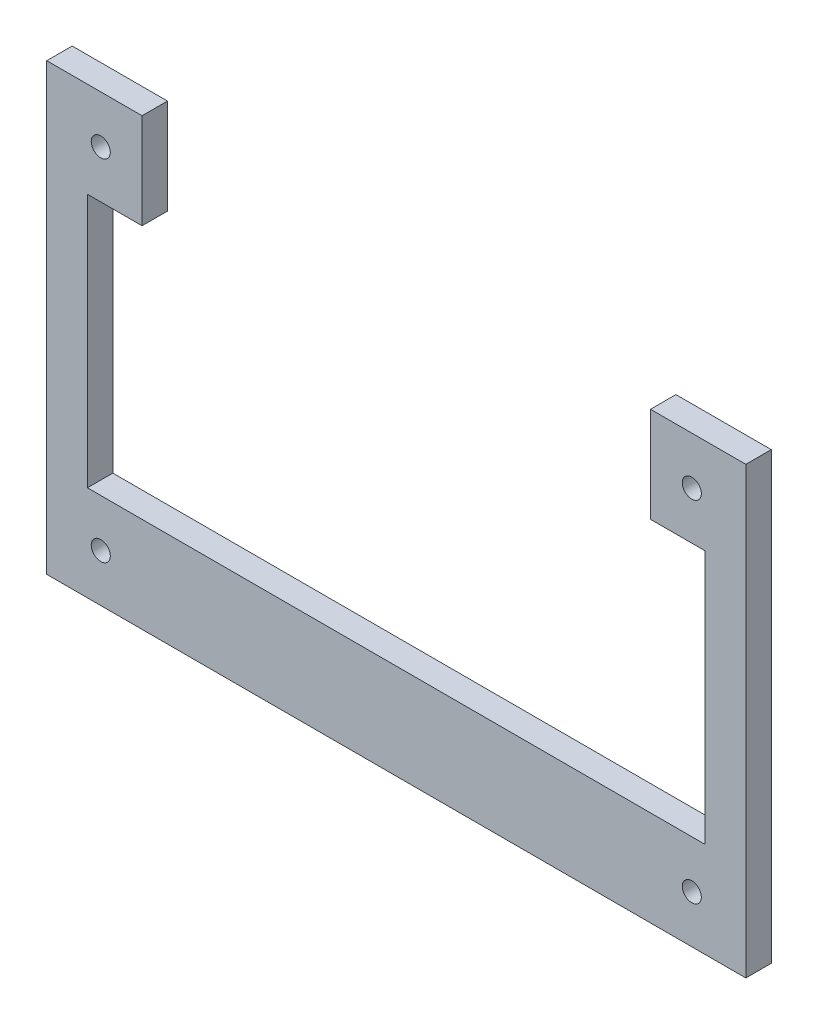
ISO-10303-21;
HEADER;
FILE_DESCRIPTION(('STEP AP214'),'2;1');
FILE_NAME('part.step','',(''),(''),'','','');
FILE_SCHEMA(('AUTOMOTIVE_DESIGN { 1 0 10303 214 1 1 1 1 }'));
ENDSEC;
DATA;
#1=APPLICATION_CONTEXT('core data for automotive mechanical design processes');
#2=APPLICATION_PROTOCOL_DEFINITION('international standard','automotive_design',2000,#1);
#3=PRODUCT_CONTEXT('',#1,'mechanical');
#4=PRODUCT('Part','Part','',(#3));
#5=PRODUCT_RELATED_PRODUCT_CATEGORY('part','',(#4));
#6=PRODUCT_DEFINITION_FORMATION('','',#4);
#7=PRODUCT_DEFINITION_CONTEXT('part definition',#1,'design');
#8=PRODUCT_DEFINITION('design','',#6,#7);
#9=PRODUCT_DEFINITION_SHAPE('','',#8);
#10=(LENGTH_UNIT() NAMED_UNIT(*) SI_UNIT(.MILLI.,.METRE.));
#11=(NAMED_UNIT(*) PLANE_ANGLE_UNIT() SI_UNIT($,.RADIAN.));
#12=(NAMED_UNIT(*) SI_UNIT($,.STERADIAN.) SOLID_ANGLE_UNIT());
#13=UNCERTAINTY_MEASURE_WITH_UNIT(LENGTH_MEASURE(1.E-05),#10,'distance_accuracy_value','');
#14=(GEOMETRIC_REPRESENTATION_CONTEXT(3) GLOBAL_UNCERTAINTY_ASSIGNED_CONTEXT((#13)) GLOBAL_UNIT_ASSIGNED_CONTEXT((#10,
#11,#12)) REPRESENTATION_CONTEXT('',''));
#15=CARTESIAN_POINT('',(0.,0.,0.));
#16=DIRECTION('',(0.,0.,1.));
#17=DIRECTION('',(1.,0.,0.));
#18=AXIS2_PLACEMENT_3D('',#15,#16,#17);
#19=CARTESIAN_POINT('',(-55.,35.,4.));
#20=DIRECTION('',(0.,-1.,0.));
#21=DIRECTION('',(0.,0.,-1.));
#22=AXIS2_PLACEMENT_3D('',#19,#20,#21);
#23=PLANE('',#22);
#24=DIRECTION('',(-1.,0.,0.));
#25=VECTOR('',#24,1.);
#26=CARTESIAN_POINT('',(-55.,35.,0.));
#27=LINE('',#26,#25);
#28=CARTESIAN_POINT('',(55.,35.,0.));
#29=VERTEX_POINT('',#28);
#30=CARTESIAN_POINT('',(40.,35.,0.));
#31=VERTEX_POINT('',#30);
#32=EDGE_CURVE('E195',#29,#31,#27,.T.);
#33=ORIENTED_EDGE('',*,*,#32,.T.);
#34=DIRECTION('',(0.,0.,-1.));
#35=VECTOR('',#34,1.);
#36=CARTESIAN_POINT('',(40.,35.,4.));
#37=LINE('',#36,#35);
#38=CARTESIAN_POINT('',(40.,35.,4.));
#39=VERTEX_POINT('',#38);
#40=EDGE_CURVE('E231',#39,#31,#37,.T.);
#41=ORIENTED_EDGE('',*,*,#40,.F.);
#42=DIRECTION('',(-1.,0.,0.));
#43=VECTOR('',#42,1.);
#44=CARTESIAN_POINT('',(-55.,35.,4.));
#45=LINE('',#44,#43);
#46=CARTESIAN_POINT('',(55.,35.,4.));
#47=VERTEX_POINT('',#46);
#48=EDGE_CURVE('E140',#47,#39,#45,.T.);
#49=ORIENTED_EDGE('',*,*,#48,.F.);
#50=DIRECTION('',(0.,0.,-1.));
#51=VECTOR('',#50,1.);
#52=CARTESIAN_POINT('',(55.,35.,4.));
#53=LINE('',#52,#51);
#54=EDGE_CURVE('E11',#47,#29,#53,.T.);
#55=ORIENTED_EDGE('',*,*,#54,.T.);
#56=EDGE_LOOP('',(#33,#41,#49,#55));
#57=FACE_BOUND('',#56,.T.);
#58=ADVANCED_FACE('F37',(#57),#23,.F.);
#59=CARTESIAN_POINT('',(48.6,20.,4.));
#60=DIRECTION('',(0.,1.,0.));
#61=DIRECTION('',(0.,0.,1.));
#62=AXIS2_PLACEMENT_3D('',#59,#60,#61);
#63=PLANE('',#62);
#64=DIRECTION('',(1.,0.,0.));
#65=VECTOR('',#64,1.);
#66=CARTESIAN_POINT('',(48.6,20.,4.));
#67=LINE('',#66,#65);
#68=CARTESIAN_POINT('',(40.,20.,4.));
#69=VERTEX_POINT('',#68);
#70=CARTESIAN_POINT('',(48.6,20.,4.));
#71=VERTEX_POINT('',#70);
#72=EDGE_CURVE('E137',#69,#71,#67,.T.);
#73=ORIENTED_EDGE('',*,*,#72,.F.);
#74=DIRECTION('',(0.,0.,-1.));
#75=VECTOR('',#74,1.);
#76=CARTESIAN_POINT('',(40.,20.,4.));
#77=LINE('',#76,#75);
#78=CARTESIAN_POINT('',(40.,20.,0.));
#79=VERTEX_POINT('',#78);
#80=EDGE_CURVE('E123',#69,#79,#77,.T.);
#81=ORIENTED_EDGE('',*,*,#80,.T.);
#82=DIRECTION('',(1.,0.,0.));
#83=VECTOR('',#82,1.);
#84=CARTESIAN_POINT('',(48.6,20.,0.));
#85=LINE('',#84,#83);
#86=CARTESIAN_POINT('',(48.6,20.,0.));
#87=VERTEX_POINT('',#86);
#88=EDGE_CURVE('E164',#79,#87,#85,.T.);
#89=ORIENTED_EDGE('',*,*,#88,.T.);
#90=DIRECTION('',(0.,0.,-1.));
#91=VECTOR('',#90,1.);
#92=CARTESIAN_POINT('',(48.6,20.,4.));
#93=LINE('',#92,#91);
#94=EDGE_CURVE('E146',#71,#87,#93,.T.);
#95=ORIENTED_EDGE('',*,*,#94,.F.);
#96=EDGE_LOOP('',(#73,#81,#89,#95));
#97=FACE_BOUND('',#96,.T.);
#98=ADVANCED_FACE('F144',(#97),#63,.F.);
#99=CARTESIAN_POINT('',(55.,-35.,4.));
#100=DIRECTION('',(-1.,0.,0.));
#101=DIRECTION('',(0.,0.,1.));
#102=AXIS2_PLACEMENT_3D('',#99,#100,#101);
#103=PLANE('',#102);
#104=DIRECTION('',(0.,1.,0.));
#105=VECTOR('',#104,1.);
#106=CARTESIAN_POINT('',(55.,-35.,0.));
#107=LINE('',#106,#105);
#108=CARTESIAN_POINT('',(55.,-35.,0.));
#109=VERTEX_POINT('',#108);
#110=EDGE_CURVE('E176',#109,#29,#107,.T.);
#111=ORIENTED_EDGE('',*,*,#110,.T.);
#112=ORIENTED_EDGE('',*,*,#54,.F.);
#113=DIRECTION('',(0.,1.,0.));
#114=VECTOR('',#113,1.);
#115=CARTESIAN_POINT('',(55.,-35.,4.));
#116=LINE('',#115,#114);
#117=CARTESIAN_POINT('',(55.,-35.,4.));
#118=VERTEX_POINT('',#117);
#119=EDGE_CURVE('E182',#118,#47,#116,.T.);
#120=ORIENTED_EDGE('',*,*,#119,.F.);
#121=DIRECTION('',(0.,0.,-1.));
#122=VECTOR('',#121,1.);
#123=CARTESIAN_POINT('',(55.,-35.,4.));
#124=LINE('',#123,#122);
#125=EDGE_CURVE('E191',#118,#109,#124,.T.);
#126=ORIENTED_EDGE('',*,*,#125,.T.);
#127=EDGE_LOOP('',(#111,#112,#120,#126));
#128=FACE_BOUND('',#127,.T.);
#129=ADVANCED_FACE('F39',(#128),#103,.F.);
#130=CARTESIAN_POINT('',(-40.,35.,4.));
#131=VERTEX_POINT('',#130);
#132=CARTESIAN_POINT('',(-55.,35.,4.));
#133=VERTEX_POINT('',#132);
#134=EDGE_CURVE('E184',#131,#133,#45,.T.);
#135=ORIENTED_EDGE('',*,*,#134,.F.);
#136=DIRECTION('',(0.,0.,-1.));
#137=VECTOR('',#136,1.);
#138=CARTESIAN_POINT('',(-40.,35.,4.));
#139=LINE('',#138,#137);
#140=CARTESIAN_POINT('',(-40.,35.,0.));
#141=VERTEX_POINT('',#140);
#142=EDGE_CURVE('E230',#131,#141,#139,.T.);
#143=ORIENTED_EDGE('',*,*,#142,.T.);
#144=CARTESIAN_POINT('',(-55.,35.,0.));
#145=VERTEX_POINT('',#144);
#146=EDGE_CURVE('E194',#141,#145,#27,.T.);
#147=ORIENTED_EDGE('',*,*,#146,.T.);
#148=DIRECTION('',(0.,0.,-1.));
#149=VECTOR('',#148,1.);
#150=CARTESIAN_POINT('',(-55.,35.,4.));
#151=LINE('',#150,#149);
#152=EDGE_CURVE('E45',#133,#145,#151,.T.);
#153=ORIENTED_EDGE('',*,*,#152,.F.);
#154=EDGE_LOOP('',(#135,#143,#147,#153));
#155=FACE_BOUND('',#154,.T.);
#156=ADVANCED_FACE('F229',(#155),#23,.F.);
#157=CARTESIAN_POINT('',(-55.,-35.,4.));
#158=DIRECTION('',(1.,0.,0.));
#159=DIRECTION('',(0.,0.,-1.));
#160=AXIS2_PLACEMENT_3D('',#157,#158,#159);
#161=PLANE('',#160);
#162=DIRECTION('',(0.,-1.,0.));
#163=VECTOR('',#162,1.);
#164=CARTESIAN_POINT('',(-55.,-35.,0.));
#165=LINE('',#164,#163);
#166=CARTESIAN_POINT('',(-55.,-35.,0.));
#167=VERTEX_POINT('',#166);
#168=EDGE_CURVE('E198',#145,#167,#165,.T.);
#169=ORIENTED_EDGE('',*,*,#168,.T.);
#170=DIRECTION('',(0.,0.,-1.));
#171=VECTOR('',#170,1.);
#172=CARTESIAN_POINT('',(-55.,-35.,4.));
#173=LINE('',#172,#171);
#174=CARTESIAN_POINT('',(-55.,-35.,4.));
#175=VERTEX_POINT('',#174);
#176=EDGE_CURVE('E203',#175,#167,#173,.T.);
#177=ORIENTED_EDGE('',*,*,#176,.F.);
#178=DIRECTION('',(0.,-1.,0.));
#179=VECTOR('',#178,1.);
#180=CARTESIAN_POINT('',(-55.,-35.,4.));
#181=LINE('',#180,#179);
#182=EDGE_CURVE('E187',#133,#175,#181,.T.);
#183=ORIENTED_EDGE('',*,*,#182,.F.);
#184=ORIENTED_EDGE('',*,*,#152,.T.);
#185=EDGE_LOOP('',(#169,#177,#183,#184));
#186=FACE_BOUND('',#185,.T.);
#187=ADVANCED_FACE('F210',(#186),#161,.F.);
#188=CARTESIAN_POINT('',(-55.,-35.,4.));
#189=DIRECTION('',(0.,1.,0.));
#190=DIRECTION('',(0.,0.,1.));
#191=AXIS2_PLACEMENT_3D('',#188,#189,#190);
#192=PLANE('',#191);
#193=DIRECTION('',(1.,0.,0.));
#194=VECTOR('',#193,1.);
#195=CARTESIAN_POINT('',(-55.,-35.,0.));
#196=LINE('',#195,#194);
#197=EDGE_CURVE('E185',#167,#109,#196,.T.);
#198=ORIENTED_EDGE('',*,*,#197,.T.);
#199=ORIENTED_EDGE('',*,*,#125,.F.);
#200=DIRECTION('',(1.,0.,0.));
#201=VECTOR('',#200,1.);
#202=CARTESIAN_POINT('',(-55.,-35.,4.));
#203=LINE('',#202,#201);
#204=EDGE_CURVE('E189',#175,#118,#203,.T.);
#205=ORIENTED_EDGE('',*,*,#204,.F.);
#206=ORIENTED_EDGE('',*,*,#176,.T.);
#207=EDGE_LOOP('',(#198,#199,#205,#206));
#208=FACE_BOUND('',#207,.T.);
#209=ADVANCED_FACE('F223',(#208),#192,.F.);
#210=CARTESIAN_POINT('',(0.,0.,4.));
#211=DIRECTION('',(0.,0.,-1.));
#212=DIRECTION('',(-1.,0.,0.));
#213=AXIS2_PLACEMENT_3D('',#210,#211,#212);
#214=PLANE('',#213);
#215=CARTESIAN_POINT('',(46.5,27.5,4.));
#216=DIRECTION('',(0.,0.,-1.));
#217=DIRECTION('',(-1.,0.,0.));
#218=AXIS2_PLACEMENT_3D('',#215,#216,#217);
#219=CIRCLE('',#218,1.5);
#220=CARTESIAN_POINT('',(45.,27.5,4.));
#221=VERTEX_POINT('',#220);
#222=EDGE_CURVE('E240',#221,#221,#219,.T.);
#223=ORIENTED_EDGE('',*,*,#222,.T.);
#224=EDGE_LOOP('',(#223));
#225=FACE_BOUND('',#224,.T.);
#226=CARTESIAN_POINT('',(-46.5,27.5,4.));
#227=DIRECTION('',(0.,0.,-1.));
#228=DIRECTION('',(-1.,0.,0.));
#229=AXIS2_PLACEMENT_3D('',#226,#227,#228);
#230=CIRCLE('',#229,1.5);
#231=CARTESIAN_POINT('',(-48.,27.5,4.));
#232=VERTEX_POINT('',#231);
#233=EDGE_CURVE('E246',#232,#232,#230,.T.);
#234=ORIENTED_EDGE('',*,*,#233,.T.);
#235=EDGE_LOOP('',(#234));
#236=FACE_BOUND('',#235,.T.);
#237=CARTESIAN_POINT('',(-46.5,-27.5,4.));
#238=DIRECTION('',(0.,0.,-1.));
#239=DIRECTION('',(-1.,0.,0.));
#240=AXIS2_PLACEMENT_3D('',#237,#238,#239);
#241=CIRCLE('',#240,1.5);
#242=CARTESIAN_POINT('',(-48.,-27.5,4.));
#243=VERTEX_POINT('',#242);
#244=EDGE_CURVE('E252',#243,#243,#241,.T.);
#245=ORIENTED_EDGE('',*,*,#244,.T.);
#246=EDGE_LOOP('',(#245));
#247=FACE_BOUND('',#246,.T.);
#248=CARTESIAN_POINT('',(46.5,-27.5,4.));
#249=DIRECTION('',(0.,0.,-1.));
#250=DIRECTION('',(-1.,0.,0.));
#251=AXIS2_PLACEMENT_3D('',#248,#249,#250);
#252=CIRCLE('',#251,1.5);
#253=CARTESIAN_POINT('',(45.,-27.5,4.));
#254=VERTEX_POINT('',#253);
#255=EDGE_CURVE('E165',#254,#254,#252,.T.);
#256=ORIENTED_EDGE('',*,*,#255,.T.);
#257=EDGE_LOOP('',(#256));
#258=FACE_BOUND('',#257,.T.);
#259=ORIENTED_EDGE('',*,*,#48,.T.);
#260=DIRECTION('',(0.,-1.,0.));
#261=VECTOR('',#260,1.);
#262=CARTESIAN_POINT('',(40.,20.,4.));
#263=LINE('',#262,#261);
#264=EDGE_CURVE('E126',#39,#69,#263,.T.);
#265=ORIENTED_EDGE('',*,*,#264,.T.);
#266=ORIENTED_EDGE('',*,*,#72,.T.);
#267=DIRECTION('',(0.,-1.,0.));
#268=VECTOR('',#267,1.);
#269=CARTESIAN_POINT('',(48.6,-20.,4.));
#270=LINE('',#269,#268);
#271=CARTESIAN_POINT('',(48.6,-20.,4.));
#272=VERTEX_POINT('',#271);
#273=EDGE_CURVE('E151',#71,#272,#270,.T.);
#274=ORIENTED_EDGE('',*,*,#273,.T.);
#275=DIRECTION('',(-1.,0.,0.));
#276=VECTOR('',#275,1.);
#277=CARTESIAN_POINT('',(48.6,-20.,4.));
#278=LINE('',#277,#276);
#279=CARTESIAN_POINT('',(-48.6,-20.,4.));
#280=VERTEX_POINT('',#279);
#281=EDGE_CURVE('E158',#272,#280,#278,.T.);
#282=ORIENTED_EDGE('',*,*,#281,.T.);
#283=DIRECTION('',(0.,1.,0.));
#284=VECTOR('',#283,1.);
#285=CARTESIAN_POINT('',(-48.6,-20.,4.));
#286=LINE('',#285,#284);
#287=CARTESIAN_POINT('',(-48.6,20.,4.));
#288=VERTEX_POINT('',#287);
#289=EDGE_CURVE('E148',#280,#288,#286,.T.);
#290=ORIENTED_EDGE('',*,*,#289,.T.);
#291=CARTESIAN_POINT('',(-40.,20.,4.));
#292=VERTEX_POINT('',#291);
#293=EDGE_CURVE('E147',#288,#292,#67,.T.);
#294=ORIENTED_EDGE('',*,*,#293,.T.);
#295=DIRECTION('',(0.,1.,0.));
#296=VECTOR('',#295,1.);
#297=CARTESIAN_POINT('',(-40.,20.,4.));
#298=LINE('',#297,#296);
#299=EDGE_CURVE('E52',#292,#131,#298,.T.);
#300=ORIENTED_EDGE('',*,*,#299,.T.);
#301=ORIENTED_EDGE('',*,*,#134,.T.);
#302=ORIENTED_EDGE('',*,*,#182,.T.);
#303=ORIENTED_EDGE('',*,*,#204,.T.);
#304=ORIENTED_EDGE('',*,*,#119,.T.);
#305=EDGE_LOOP('',(#259,#265,#266,#274,#282,#290,#294,#300,#301,#302,#303,#304));
#306=FACE_BOUND('',#305,.T.);
#307=ADVANCED_FACE('F135',(#225,#236,#247,#258,#306),#214,.F.);
#308=CARTESIAN_POINT('',(0.,0.,0.));
#309=DIRECTION('',(0.,0.,-1.));
#310=DIRECTION('',(-1.,0.,0.));
#311=AXIS2_PLACEMENT_3D('',#308,#309,#310);
#312=PLANE('',#311);
#313=DIRECTION('',(0.,-1.,0.));
#314=VECTOR('',#313,1.);
#315=CARTESIAN_POINT('',(40.,20.,0.));
#316=LINE('',#315,#314);
#317=EDGE_CURVE('E60',#31,#79,#316,.T.);
#318=ORIENTED_EDGE('',*,*,#317,.F.);
#319=ORIENTED_EDGE('',*,*,#32,.F.);
#320=ORIENTED_EDGE('',*,*,#110,.F.);
#321=ORIENTED_EDGE('',*,*,#197,.F.);
#322=ORIENTED_EDGE('',*,*,#168,.F.);
#323=ORIENTED_EDGE('',*,*,#146,.F.);
#324=DIRECTION('',(0.,1.,0.));
#325=VECTOR('',#324,1.);
#326=CARTESIAN_POINT('',(-40.,20.,0.));
#327=LINE('',#326,#325);
#328=CARTESIAN_POINT('',(-40.,20.,0.));
#329=VERTEX_POINT('',#328);
#330=EDGE_CURVE('E141',#329,#141,#327,.T.);
#331=ORIENTED_EDGE('',*,*,#330,.F.);
#332=CARTESIAN_POINT('',(-48.6,20.,0.));
#333=VERTEX_POINT('',#332);
#334=EDGE_CURVE('E166',#333,#329,#85,.T.);
#335=ORIENTED_EDGE('',*,*,#334,.F.);
#336=DIRECTION('',(0.,1.,0.));
#337=VECTOR('',#336,1.);
#338=CARTESIAN_POINT('',(-48.6,-20.,0.));
#339=LINE('',#338,#337);
#340=CARTESIAN_POINT('',(-48.6,-20.,0.));
#341=VERTEX_POINT('',#340);
#342=EDGE_CURVE('E162',#341,#333,#339,.T.);
#343=ORIENTED_EDGE('',*,*,#342,.F.);
#344=DIRECTION('',(-1.,0.,0.));
#345=VECTOR('',#344,1.);
#346=CARTESIAN_POINT('',(48.6,-20.,0.));
#347=LINE('',#346,#345);
#348=CARTESIAN_POINT('',(48.6,-20.,0.));
#349=VERTEX_POINT('',#348);
#350=EDGE_CURVE('E153',#349,#341,#347,.T.);
#351=ORIENTED_EDGE('',*,*,#350,.F.);
#352=DIRECTION('',(0.,-1.,0.));
#353=VECTOR('',#352,1.);
#354=CARTESIAN_POINT('',(48.6,-20.,0.));
#355=LINE('',#354,#353);
#356=EDGE_CURVE('E169',#87,#349,#355,.T.);
#357=ORIENTED_EDGE('',*,*,#356,.F.);
#358=ORIENTED_EDGE('',*,*,#88,.F.);
#359=EDGE_LOOP('',(#318,#319,#320,#321,#322,#323,#331,#335,#343,#351,#357,#358));
#360=FACE_BOUND('',#359,.T.);
#361=CARTESIAN_POINT('',(46.5,27.5,0.));
#362=DIRECTION('',(0.,0.,-1.));
#363=DIRECTION('',(-1.,0.,0.));
#364=AXIS2_PLACEMENT_3D('',#361,#362,#363);
#365=CIRCLE('',#364,1.5);
#366=CARTESIAN_POINT('',(45.,27.5,0.));
#367=VERTEX_POINT('',#366);
#368=EDGE_CURVE('E233',#367,#367,#365,.T.);
#369=ORIENTED_EDGE('',*,*,#368,.F.);
#370=EDGE_LOOP('',(#369));
#371=FACE_BOUND('',#370,.T.);
#372=CARTESIAN_POINT('',(-46.5,27.5,0.));
#373=DIRECTION('',(0.,0.,-1.));
#374=DIRECTION('',(-1.,0.,0.));
#375=AXIS2_PLACEMENT_3D('',#372,#373,#374);
#376=CIRCLE('',#375,1.5);
#377=CARTESIAN_POINT('',(-48.,27.5,0.));
#378=VERTEX_POINT('',#377);
#379=EDGE_CURVE('E243',#378,#378,#376,.T.);
#380=ORIENTED_EDGE('',*,*,#379,.F.);
#381=EDGE_LOOP('',(#380));
#382=FACE_BOUND('',#381,.T.);
#383=CARTESIAN_POINT('',(-46.5,-27.5,0.));
#384=DIRECTION('',(0.,0.,-1.));
#385=DIRECTION('',(-1.,0.,0.));
#386=AXIS2_PLACEMENT_3D('',#383,#384,#385);
#387=CIRCLE('',#386,1.5);
#388=CARTESIAN_POINT('',(-48.,-27.5,0.));
#389=VERTEX_POINT('',#388);
#390=EDGE_CURVE('E249',#389,#389,#387,.T.);
#391=ORIENTED_EDGE('',*,*,#390,.F.);
#392=EDGE_LOOP('',(#391));
#393=FACE_BOUND('',#392,.T.);
#394=CARTESIAN_POINT('',(46.5,-27.5,0.));
#395=DIRECTION('',(0.,0.,-1.));
#396=DIRECTION('',(-1.,0.,0.));
#397=AXIS2_PLACEMENT_3D('',#394,#395,#396);
#398=CIRCLE('',#397,1.5);
#399=CARTESIAN_POINT('',(45.,-27.5,0.));
#400=VERTEX_POINT('',#399);
#401=EDGE_CURVE('E255',#400,#400,#398,.T.);
#402=ORIENTED_EDGE('',*,*,#401,.F.);
#403=EDGE_LOOP('',(#402));
#404=FACE_BOUND('',#403,.T.);
#405=ADVANCED_FACE('F217',(#360,#371,#382,#393,#404),#312,.T.);
#406=CARTESIAN_POINT('',(-48.6,-20.,4.));
#407=DIRECTION('',(-1.,0.,0.));
#408=DIRECTION('',(0.,0.,1.));
#409=AXIS2_PLACEMENT_3D('',#406,#407,#408);
#410=PLANE('',#409);
#411=ORIENTED_EDGE('',*,*,#342,.T.);
#412=DIRECTION('',(0.,0.,-1.));
#413=VECTOR('',#412,1.);
#414=CARTESIAN_POINT('',(-48.6,20.,4.));
#415=LINE('',#414,#413);
#416=EDGE_CURVE('E161',#288,#333,#415,.T.);
#417=ORIENTED_EDGE('',*,*,#416,.F.);
#418=ORIENTED_EDGE('',*,*,#289,.F.);
#419=DIRECTION('',(0.,0.,-1.));
#420=VECTOR('',#419,1.);
#421=CARTESIAN_POINT('',(-48.6,-20.,4.));
#422=LINE('',#421,#420);
#423=EDGE_CURVE('E174',#280,#341,#422,.T.);
#424=ORIENTED_EDGE('',*,*,#423,.T.);
#425=EDGE_LOOP('',(#411,#417,#418,#424));
#426=FACE_BOUND('',#425,.T.);
#427=ADVANCED_FACE('F270',(#426),#410,.F.);
#428=CARTESIAN_POINT('',(48.6,-20.,4.));
#429=DIRECTION('',(0.,-1.,0.));
#430=DIRECTION('',(0.,0.,-1.));
#431=AXIS2_PLACEMENT_3D('',#428,#429,#430);
#432=PLANE('',#431);
#433=ORIENTED_EDGE('',*,*,#350,.T.);
#434=ORIENTED_EDGE('',*,*,#423,.F.);
#435=ORIENTED_EDGE('',*,*,#281,.F.);
#436=DIRECTION('',(0.,0.,-1.));
#437=VECTOR('',#436,1.);
#438=CARTESIAN_POINT('',(48.6,-20.,4.));
#439=LINE('',#438,#437);
#440=EDGE_CURVE('E177',#272,#349,#439,.T.);
#441=ORIENTED_EDGE('',*,*,#440,.T.);
#442=EDGE_LOOP('',(#433,#434,#435,#441));
#443=FACE_BOUND('',#442,.T.);
#444=ADVANCED_FACE('F277',(#443),#432,.F.);
#445=CARTESIAN_POINT('',(48.6,-20.,4.));
#446=DIRECTION('',(1.,0.,0.));
#447=DIRECTION('',(0.,0.,-1.));
#448=AXIS2_PLACEMENT_3D('',#445,#446,#447);
#449=PLANE('',#448);
#450=ORIENTED_EDGE('',*,*,#356,.T.);
#451=ORIENTED_EDGE('',*,*,#440,.F.);
#452=ORIENTED_EDGE('',*,*,#273,.F.);
#453=ORIENTED_EDGE('',*,*,#94,.T.);
#454=EDGE_LOOP('',(#450,#451,#452,#453));
#455=FACE_BOUND('',#454,.T.);
#456=ADVANCED_FACE('F335',(#455),#449,.F.);
#457=ORIENTED_EDGE('',*,*,#334,.T.);
#458=DIRECTION('',(0.,0.,-1.));
#459=VECTOR('',#458,1.);
#460=CARTESIAN_POINT('',(-40.,20.,4.));
#461=LINE('',#460,#459);
#462=EDGE_CURVE('E131',#292,#329,#461,.T.);
#463=ORIENTED_EDGE('',*,*,#462,.F.);
#464=ORIENTED_EDGE('',*,*,#293,.F.);
#465=ORIENTED_EDGE('',*,*,#416,.T.);
#466=EDGE_LOOP('',(#457,#463,#464,#465));
#467=FACE_BOUND('',#466,.T.);
#468=ADVANCED_FACE('F265',(#467),#63,.F.);
#469=CARTESIAN_POINT('',(46.5,-27.5,0.));
#470=DIRECTION('',(0.,0.,-1.));
#471=DIRECTION('',(-1.,0.,0.));
#472=AXIS2_PLACEMENT_3D('',#469,#470,#471);
#473=CYLINDRICAL_SURFACE('',#472,1.5);
#474=ORIENTED_EDGE('',*,*,#255,.F.);
#475=EDGE_LOOP('',(#474));
#476=FACE_BOUND('',#475,.T.);
#477=ORIENTED_EDGE('',*,*,#401,.T.);
#478=EDGE_LOOP('',(#477));
#479=FACE_BOUND('',#478,.T.);
#480=ADVANCED_FACE('F261',(#476,#479),#473,.F.);
#481=CARTESIAN_POINT('',(-46.5,-27.5,0.));
#482=DIRECTION('',(0.,0.,-1.));
#483=DIRECTION('',(-1.,0.,0.));
#484=AXIS2_PLACEMENT_3D('',#481,#482,#483);
#485=CYLINDRICAL_SURFACE('',#484,1.5);
#486=ORIENTED_EDGE('',*,*,#244,.F.);
#487=EDGE_LOOP('',(#486));
#488=FACE_BOUND('',#487,.T.);
#489=ORIENTED_EDGE('',*,*,#390,.T.);
#490=EDGE_LOOP('',(#489));
#491=FACE_BOUND('',#490,.T.);
#492=ADVANCED_FACE('F264',(#488,#491),#485,.F.);
#493=CARTESIAN_POINT('',(-46.5,27.5,0.));
#494=DIRECTION('',(0.,0.,-1.));
#495=DIRECTION('',(-1.,0.,0.));
#496=AXIS2_PLACEMENT_3D('',#493,#494,#495);
#497=CYLINDRICAL_SURFACE('',#496,1.5);
#498=ORIENTED_EDGE('',*,*,#233,.F.);
#499=EDGE_LOOP('',(#498));
#500=FACE_BOUND('',#499,.T.);
#501=ORIENTED_EDGE('',*,*,#379,.T.);
#502=EDGE_LOOP('',(#501));
#503=FACE_BOUND('',#502,.T.);
#504=ADVANCED_FACE('F362',(#500,#503),#497,.F.);
#505=CARTESIAN_POINT('',(46.5,27.5,0.));
#506=DIRECTION('',(0.,0.,-1.));
#507=DIRECTION('',(-1.,0.,0.));
#508=AXIS2_PLACEMENT_3D('',#505,#506,#507);
#509=CYLINDRICAL_SURFACE('',#508,1.5);
#510=ORIENTED_EDGE('',*,*,#222,.F.);
#511=EDGE_LOOP('',(#510));
#512=FACE_BOUND('',#511,.T.);
#513=ORIENTED_EDGE('',*,*,#368,.T.);
#514=EDGE_LOOP('',(#513));
#515=FACE_BOUND('',#514,.T.);
#516=ADVANCED_FACE('F370',(#512,#515),#509,.F.);
#517=CARTESIAN_POINT('',(-40.,20.,4.));
#518=DIRECTION('',(-1.,0.,0.));
#519=DIRECTION('',(0.,0.,1.));
#520=AXIS2_PLACEMENT_3D('',#517,#518,#519);
#521=PLANE('',#520);
#522=ORIENTED_EDGE('',*,*,#330,.T.);
#523=ORIENTED_EDGE('',*,*,#142,.F.);
#524=ORIENTED_EDGE('',*,*,#299,.F.);
#525=ORIENTED_EDGE('',*,*,#462,.T.);
#526=EDGE_LOOP('',(#522,#523,#524,#525));
#527=FACE_BOUND('',#526,.T.);
#528=ADVANCED_FACE('F378',(#527),#521,.F.);
#529=CARTESIAN_POINT('',(40.,20.,4.));
#530=DIRECTION('',(1.,0.,0.));
#531=DIRECTION('',(0.,0.,-1.));
#532=AXIS2_PLACEMENT_3D('',#529,#530,#531);
#533=PLANE('',#532);
#534=ORIENTED_EDGE('',*,*,#317,.T.);
#535=ORIENTED_EDGE('',*,*,#80,.F.);
#536=ORIENTED_EDGE('',*,*,#264,.F.);
#537=ORIENTED_EDGE('',*,*,#40,.T.);
#538=EDGE_LOOP('',(#534,#535,#536,#537));
#539=FACE_BOUND('',#538,.T.);
#540=ADVANCED_FACE('F125',(#539),#533,.F.);
#541=CLOSED_SHELL('',(#58,#98,#129,#156,#187,#209,#307,#405,#427,#444,#456,#468,#480,#492,#504,
#516,#528,#540));
#542=MANIFOLD_SOLID_BREP('B2',#541);
#543=ADVANCED_BREP_SHAPE_REPRESENTATION('',(#18,#542),#14);
#544=SHAPE_DEFINITION_REPRESENTATION(#9,#543);
ENDSEC;
END-ISO-10303-21;
